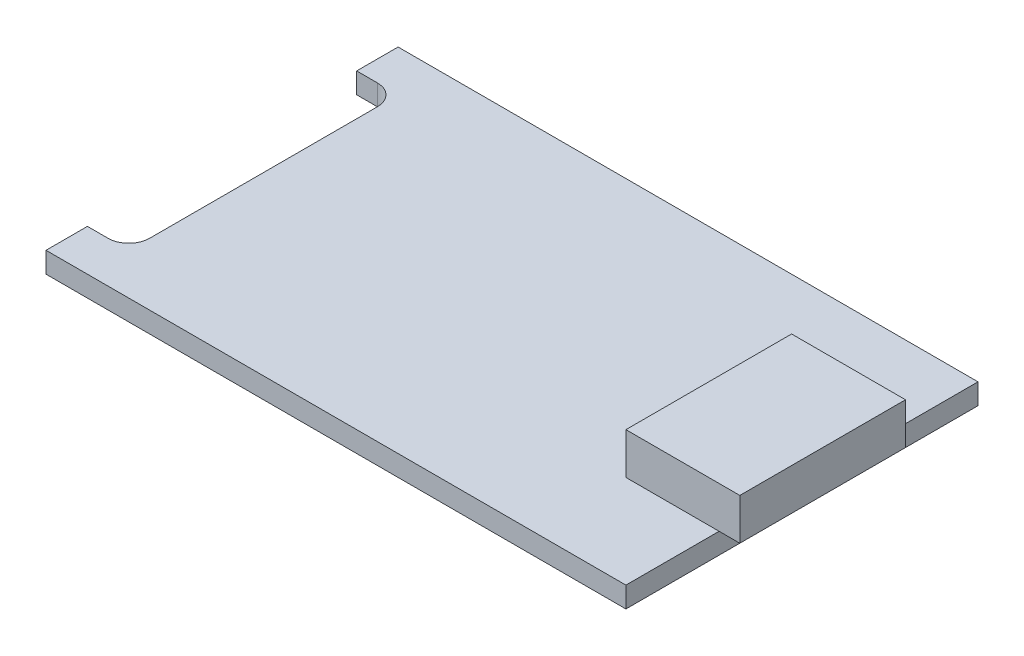
ISO-10303-21;
HEADER;
FILE_DESCRIPTION(('STEP AP214'),'2;1');
FILE_NAME('part.step','',(''),(''),'','','');
FILE_SCHEMA(('AUTOMOTIVE_DESIGN { 1 0 10303 214 1 1 1 1 }'));
ENDSEC;
DATA;
#1=APPLICATION_CONTEXT('core data for automotive mechanical design processes');
#2=APPLICATION_PROTOCOL_DEFINITION('international standard','automotive_design',2000,#1);
#3=PRODUCT_CONTEXT('',#1,'mechanical');
#4=PRODUCT('Part','Part','',(#3));
#5=PRODUCT_RELATED_PRODUCT_CATEGORY('part','',(#4));
#6=PRODUCT_DEFINITION_FORMATION('','',#4);
#7=PRODUCT_DEFINITION_CONTEXT('part definition',#1,'design');
#8=PRODUCT_DEFINITION('design','',#6,#7);
#9=PRODUCT_DEFINITION_SHAPE('','',#8);
#10=(LENGTH_UNIT() NAMED_UNIT(*) SI_UNIT(.MILLI.,.METRE.));
#11=(NAMED_UNIT(*) PLANE_ANGLE_UNIT() SI_UNIT($,.RADIAN.));
#12=(NAMED_UNIT(*) SI_UNIT($,.STERADIAN.) SOLID_ANGLE_UNIT());
#13=UNCERTAINTY_MEASURE_WITH_UNIT(LENGTH_MEASURE(1.E-05),#10,'distance_accuracy_value','');
#14=(GEOMETRIC_REPRESENTATION_CONTEXT(3) GLOBAL_UNCERTAINTY_ASSIGNED_CONTEXT((#13)) GLOBAL_UNIT_ASSIGNED_CONTEXT((#10,
#11,#12)) REPRESENTATION_CONTEXT('',''));
#15=CARTESIAN_POINT('',(0.,0.,0.));
#16=DIRECTION('',(0.,0.,1.));
#17=DIRECTION('',(1.,0.,0.));
#18=AXIS2_PLACEMENT_3D('',#15,#16,#17);
#19=CARTESIAN_POINT('',(-14.,1.,8.5));
#20=DIRECTION('',(1.,0.,0.));
#21=DIRECTION('',(0.,0.,-1.));
#22=AXIS2_PLACEMENT_3D('',#19,#20,#21);
#23=PLANE('',#22);
#24=DIRECTION('',(0.,0.,1.));
#25=VECTOR('',#24,1.);
#26=CARTESIAN_POINT('',(-14.,0.,8.5));
#27=LINE('',#26,#25);
#28=CARTESIAN_POINT('',(-14.,0.,-8.5));
#29=VERTEX_POINT('',#28);
#30=CARTESIAN_POINT('',(-14.,0.,-6.5));
#31=VERTEX_POINT('',#30);
#32=EDGE_CURVE('E167',#29,#31,#27,.T.);
#33=ORIENTED_EDGE('',*,*,#32,.T.);
#34=DIRECTION('',(0.,1.,0.));
#35=VECTOR('',#34,1.);
#36=CARTESIAN_POINT('',(-14.,0.,-6.5));
#37=LINE('',#36,#35);
#38=CARTESIAN_POINT('',(-14.,1.,-6.5));
#39=VERTEX_POINT('',#38);
#40=EDGE_CURVE('E160',#31,#39,#37,.T.);
#41=ORIENTED_EDGE('',*,*,#40,.T.);
#42=DIRECTION('',(0.,0.,1.));
#43=VECTOR('',#42,1.);
#44=CARTESIAN_POINT('',(-14.,1.,8.5));
#45=LINE('',#44,#43);
#46=CARTESIAN_POINT('',(-14.,1.,-8.5));
#47=VERTEX_POINT('',#46);
#48=EDGE_CURVE('E260',#47,#39,#45,.T.);
#49=ORIENTED_EDGE('',*,*,#48,.F.);
#50=DIRECTION('',(0.,-1.,0.));
#51=VECTOR('',#50,1.);
#52=CARTESIAN_POINT('',(-14.,1.,-8.5));
#53=LINE('',#52,#51);
#54=EDGE_CURVE('E183',#47,#29,#53,.T.);
#55=ORIENTED_EDGE('',*,*,#54,.T.);
#56=EDGE_LOOP('',(#33,#41,#49,#55));
#57=FACE_BOUND('',#56,.T.);
#58=ADVANCED_FACE('F35',(#57),#23,.F.);
#59=CARTESIAN_POINT('',(0.,1.,0.));
#60=DIRECTION('',(0.,-1.,0.));
#61=DIRECTION('',(0.,0.,-1.));
#62=AXIS2_PLACEMENT_3D('',#59,#60,#61);
#63=PLANE('',#62);
#64=ORIENTED_EDGE('',*,*,#48,.T.);
#65=DIRECTION('',(-1.,0.,0.));
#66=VECTOR('',#65,1.);
#67=CARTESIAN_POINT('',(-14.,1.,-6.5));
#68=LINE('',#67,#66);
#69=CARTESIAN_POINT('',(-13.,1.,-6.5));
#70=VERTEX_POINT('',#69);
#71=EDGE_CURVE('E151',#70,#39,#68,.T.);
#72=ORIENTED_EDGE('',*,*,#71,.F.);
#73=CARTESIAN_POINT('',(-13.,1.,-5.5));
#74=DIRECTION('',(0.,-1.,0.));
#75=DIRECTION('',(0.,0.,-1.));
#76=AXIS2_PLACEMENT_3D('',#73,#74,#75);
#77=CIRCLE('',#76,1.);
#78=CARTESIAN_POINT('',(-12.,1.,-5.5));
#79=VERTEX_POINT('',#78);
#80=EDGE_CURVE('E43',#70,#79,#77,.T.);
#81=ORIENTED_EDGE('',*,*,#80,.T.);
#82=DIRECTION('',(0.,0.,-1.));
#83=VECTOR('',#82,1.);
#84=CARTESIAN_POINT('',(-12.,1.,-6.5));
#85=LINE('',#84,#83);
#86=CARTESIAN_POINT('',(-12.,1.,5.5));
#87=VERTEX_POINT('',#86);
#88=EDGE_CURVE('E212',#87,#79,#85,.T.);
#89=ORIENTED_EDGE('',*,*,#88,.F.);
#90=CARTESIAN_POINT('',(-13.,1.,5.5));
#91=DIRECTION('',(0.,-1.,0.));
#92=DIRECTION('',(0.,0.,-1.));
#93=AXIS2_PLACEMENT_3D('',#90,#91,#92);
#94=CIRCLE('',#93,1.);
#95=CARTESIAN_POINT('',(-13.,1.,6.5));
#96=VERTEX_POINT('',#95);
#97=EDGE_CURVE('E203',#87,#96,#94,.T.);
#98=ORIENTED_EDGE('',*,*,#97,.T.);
#99=DIRECTION('',(1.,0.,0.));
#100=VECTOR('',#99,1.);
#101=CARTESIAN_POINT('',(-14.,1.,6.5));
#102=LINE('',#101,#100);
#103=CARTESIAN_POINT('',(-14.,1.,6.5));
#104=VERTEX_POINT('',#103);
#105=EDGE_CURVE('E217',#104,#96,#102,.T.);
#106=ORIENTED_EDGE('',*,*,#105,.F.);
#107=CARTESIAN_POINT('',(-14.,1.,8.5));
#108=VERTEX_POINT('',#107);
#109=EDGE_CURVE('E159',#104,#108,#45,.T.);
#110=ORIENTED_EDGE('',*,*,#109,.T.);
#111=DIRECTION('',(1.,0.,0.));
#112=VECTOR('',#111,1.);
#113=CARTESIAN_POINT('',(-14.,1.,8.5));
#114=LINE('',#113,#112);
#115=CARTESIAN_POINT('',(14.,1.,8.5));
#116=VERTEX_POINT('',#115);
#117=EDGE_CURVE('E262',#108,#116,#114,.T.);
#118=ORIENTED_EDGE('',*,*,#117,.T.);
#119=DIRECTION('',(0.,0.,-1.));
#120=VECTOR('',#119,1.);
#121=CARTESIAN_POINT('',(14.,1.,8.5));
#122=LINE('',#121,#120);
#123=CARTESIAN_POINT('',(14.,1.,4.));
#124=VERTEX_POINT('',#123);
#125=EDGE_CURVE('E264',#116,#124,#122,.T.);
#126=ORIENTED_EDGE('',*,*,#125,.T.);
#127=DIRECTION('',(1.,0.,0.));
#128=VECTOR('',#127,1.);
#129=CARTESIAN_POINT('',(15.,1.,4.));
#130=LINE('',#129,#128);
#131=CARTESIAN_POINT('',(9.5,1.,4.));
#132=VERTEX_POINT('',#131);
#133=EDGE_CURVE('E235',#132,#124,#130,.T.);
#134=ORIENTED_EDGE('',*,*,#133,.F.);
#135=DIRECTION('',(0.,0.,1.));
#136=VECTOR('',#135,1.);
#137=CARTESIAN_POINT('',(9.5,1.,-4.));
#138=LINE('',#137,#136);
#139=CARTESIAN_POINT('',(9.5,1.,-4.));
#140=VERTEX_POINT('',#139);
#141=EDGE_CURVE('E247',#140,#132,#138,.T.);
#142=ORIENTED_EDGE('',*,*,#141,.F.);
#143=DIRECTION('',(-1.,0.,0.));
#144=VECTOR('',#143,1.);
#145=CARTESIAN_POINT('',(15.,1.,-4.));
#146=LINE('',#145,#144);
#147=CARTESIAN_POINT('',(14.,1.,-4.));
#148=VERTEX_POINT('',#147);
#149=EDGE_CURVE('E194',#148,#140,#146,.T.);
#150=ORIENTED_EDGE('',*,*,#149,.F.);
#151=CARTESIAN_POINT('',(14.,1.,-8.5));
#152=VERTEX_POINT('',#151);
#153=EDGE_CURVE('E263',#148,#152,#122,.T.);
#154=ORIENTED_EDGE('',*,*,#153,.T.);
#155=DIRECTION('',(-1.,0.,0.));
#156=VECTOR('',#155,1.);
#157=CARTESIAN_POINT('',(-14.,1.,-8.5));
#158=LINE('',#157,#156);
#159=EDGE_CURVE('E176',#152,#47,#158,.T.);
#160=ORIENTED_EDGE('',*,*,#159,.T.);
#161=EDGE_LOOP('',(#64,#72,#81,#89,#98,#106,#110,#118,#126,#134,#142,#150,#154,#160));
#162=FACE_BOUND('',#161,.T.);
#163=ADVANCED_FACE('F211',(#162),#63,.F.);
#164=ORIENTED_EDGE('',*,*,#109,.F.);
#165=DIRECTION('',(0.,1.,0.));
#166=VECTOR('',#165,1.);
#167=CARTESIAN_POINT('',(-14.,0.,6.5));
#168=LINE('',#167,#166);
#169=CARTESIAN_POINT('',(-14.,0.,6.5));
#170=VERTEX_POINT('',#169);
#171=EDGE_CURVE('E144',#170,#104,#168,.T.);
#172=ORIENTED_EDGE('',*,*,#171,.F.);
#173=CARTESIAN_POINT('',(-14.,0.,8.5));
#174=VERTEX_POINT('',#173);
#175=EDGE_CURVE('E157',#170,#174,#27,.T.);
#176=ORIENTED_EDGE('',*,*,#175,.T.);
#177=DIRECTION('',(0.,-1.,0.));
#178=VECTOR('',#177,1.);
#179=CARTESIAN_POINT('',(-14.,1.,8.5));
#180=LINE('',#179,#178);
#181=EDGE_CURVE('E192',#108,#174,#180,.T.);
#182=ORIENTED_EDGE('',*,*,#181,.F.);
#183=EDGE_LOOP('',(#164,#172,#176,#182));
#184=FACE_BOUND('',#183,.T.);
#185=ADVANCED_FACE('F155',(#184),#23,.F.);
#186=CARTESIAN_POINT('',(-14.,1.,8.5));
#187=DIRECTION('',(0.,0.,-1.));
#188=DIRECTION('',(-1.,0.,0.));
#189=AXIS2_PLACEMENT_3D('',#186,#187,#188);
#190=PLANE('',#189);
#191=DIRECTION('',(1.,0.,0.));
#192=VECTOR('',#191,1.);
#193=CARTESIAN_POINT('',(-14.,0.,8.5));
#194=LINE('',#193,#192);
#195=CARTESIAN_POINT('',(14.,0.,8.5));
#196=VERTEX_POINT('',#195);
#197=EDGE_CURVE('E165',#174,#196,#194,.T.);
#198=ORIENTED_EDGE('',*,*,#197,.T.);
#199=DIRECTION('',(0.,-1.,0.));
#200=VECTOR('',#199,1.);
#201=CARTESIAN_POINT('',(14.,1.,8.5));
#202=LINE('',#201,#200);
#203=EDGE_CURVE('E189',#116,#196,#202,.T.);
#204=ORIENTED_EDGE('',*,*,#203,.F.);
#205=ORIENTED_EDGE('',*,*,#117,.F.);
#206=ORIENTED_EDGE('',*,*,#181,.T.);
#207=EDGE_LOOP('',(#198,#204,#205,#206));
#208=FACE_BOUND('',#207,.T.);
#209=ADVANCED_FACE('F290',(#208),#190,.F.);
#210=CARTESIAN_POINT('',(14.,1.,8.5));
#211=DIRECTION('',(-1.,0.,0.));
#212=DIRECTION('',(0.,0.,1.));
#213=AXIS2_PLACEMENT_3D('',#210,#211,#212);
#214=PLANE('',#213);
#215=DIRECTION('',(0.,0.,-1.));
#216=VECTOR('',#215,1.);
#217=CARTESIAN_POINT('',(14.,0.,8.5));
#218=LINE('',#217,#216);
#219=CARTESIAN_POINT('',(14.,0.,-8.5));
#220=VERTEX_POINT('',#219);
#221=EDGE_CURVE('E179',#196,#220,#218,.T.);
#222=ORIENTED_EDGE('',*,*,#221,.T.);
#223=DIRECTION('',(0.,-1.,0.));
#224=VECTOR('',#223,1.);
#225=CARTESIAN_POINT('',(14.,1.,-8.5));
#226=LINE('',#225,#224);
#227=EDGE_CURVE('E186',#152,#220,#226,.T.);
#228=ORIENTED_EDGE('',*,*,#227,.F.);
#229=ORIENTED_EDGE('',*,*,#153,.F.);
#230=EDGE_CURVE('E266',#124,#148,#122,.T.);
#231=ORIENTED_EDGE('',*,*,#230,.F.);
#232=ORIENTED_EDGE('',*,*,#125,.F.);
#233=ORIENTED_EDGE('',*,*,#203,.T.);
#234=EDGE_LOOP('',(#222,#228,#229,#231,#232,#233));
#235=FACE_BOUND('',#234,.T.);
#236=ADVANCED_FACE('F276',(#235),#214,.F.);
#237=CARTESIAN_POINT('',(-14.,1.,-8.5));
#238=DIRECTION('',(0.,0.,1.));
#239=DIRECTION('',(1.,0.,0.));
#240=AXIS2_PLACEMENT_3D('',#237,#238,#239);
#241=PLANE('',#240);
#242=DIRECTION('',(-1.,0.,0.));
#243=VECTOR('',#242,1.);
#244=CARTESIAN_POINT('',(-14.,0.,-8.5));
#245=LINE('',#244,#243);
#246=EDGE_CURVE('E181',#220,#29,#245,.T.);
#247=ORIENTED_EDGE('',*,*,#246,.T.);
#248=ORIENTED_EDGE('',*,*,#54,.F.);
#249=ORIENTED_EDGE('',*,*,#159,.F.);
#250=ORIENTED_EDGE('',*,*,#227,.T.);
#251=EDGE_LOOP('',(#247,#248,#249,#250));
#252=FACE_BOUND('',#251,.T.);
#253=ADVANCED_FACE('F279',(#252),#241,.F.);
#254=CARTESIAN_POINT('',(0.,0.,0.));
#255=DIRECTION('',(0.,-1.,0.));
#256=DIRECTION('',(0.,0.,-1.));
#257=AXIS2_PLACEMENT_3D('',#254,#255,#256);
#258=PLANE('',#257);
#259=DIRECTION('',(0.,0.,-1.));
#260=VECTOR('',#259,1.);
#261=CARTESIAN_POINT('',(-12.,0.,-6.5));
#262=LINE('',#261,#260);
#263=CARTESIAN_POINT('',(-12.,0.,5.5));
#264=VERTEX_POINT('',#263);
#265=CARTESIAN_POINT('',(-12.,0.,-5.5));
#266=VERTEX_POINT('',#265);
#267=EDGE_CURVE('E150',#264,#266,#262,.T.);
#268=ORIENTED_EDGE('',*,*,#267,.T.);
#269=CARTESIAN_POINT('',(-13.,0.,-5.5));
#270=DIRECTION('',(0.,-1.,0.));
#271=DIRECTION('',(0.,0.,-1.));
#272=AXIS2_PLACEMENT_3D('',#269,#270,#271);
#273=CIRCLE('',#272,1.);
#274=CARTESIAN_POINT('',(-13.,0.,-6.5));
#275=VERTEX_POINT('',#274);
#276=EDGE_CURVE('E11',#266,#275,#273,.F.);
#277=ORIENTED_EDGE('',*,*,#276,.T.);
#278=DIRECTION('',(-1.,0.,0.));
#279=VECTOR('',#278,1.);
#280=CARTESIAN_POINT('',(-14.,0.,-6.5));
#281=LINE('',#280,#279);
#282=EDGE_CURVE('E161',#275,#31,#281,.T.);
#283=ORIENTED_EDGE('',*,*,#282,.T.);
#284=ORIENTED_EDGE('',*,*,#32,.F.);
#285=ORIENTED_EDGE('',*,*,#246,.F.);
#286=ORIENTED_EDGE('',*,*,#221,.F.);
#287=ORIENTED_EDGE('',*,*,#197,.F.);
#288=ORIENTED_EDGE('',*,*,#175,.F.);
#289=DIRECTION('',(1.,0.,0.));
#290=VECTOR('',#289,1.);
#291=CARTESIAN_POINT('',(-14.,0.,6.5));
#292=LINE('',#291,#290);
#293=CARTESIAN_POINT('',(-13.,0.,6.5));
#294=VERTEX_POINT('',#293);
#295=EDGE_CURVE('E140',#170,#294,#292,.T.);
#296=ORIENTED_EDGE('',*,*,#295,.T.);
#297=CARTESIAN_POINT('',(-13.,0.,5.5));
#298=DIRECTION('',(0.,-1.,0.));
#299=DIRECTION('',(0.,0.,-1.));
#300=AXIS2_PLACEMENT_3D('',#297,#298,#299);
#301=CIRCLE('',#300,1.);
#302=EDGE_CURVE('E205',#294,#264,#301,.F.);
#303=ORIENTED_EDGE('',*,*,#302,.T.);
#304=EDGE_LOOP('',(#268,#277,#283,#284,#285,#286,#287,#288,#296,#303));
#305=FACE_BOUND('',#304,.T.);
#306=ADVANCED_FACE('F163',(#305),#258,.T.);
#307=CARTESIAN_POINT('',(15.,3.,-4.));
#308=DIRECTION('',(-1.,0.,0.));
#309=DIRECTION('',(0.,0.,1.));
#310=AXIS2_PLACEMENT_3D('',#307,#308,#309);
#311=PLANE('',#310);
#312=DIRECTION('',(0.,0.,-1.));
#313=VECTOR('',#312,1.);
#314=CARTESIAN_POINT('',(15.,1.,-4.));
#315=LINE('',#314,#313);
#316=CARTESIAN_POINT('',(15.,1.,4.));
#317=VERTEX_POINT('',#316);
#318=CARTESIAN_POINT('',(15.,1.,-4.));
#319=VERTEX_POINT('',#318);
#320=EDGE_CURVE('E229',#317,#319,#315,.T.);
#321=ORIENTED_EDGE('',*,*,#320,.T.);
#322=DIRECTION('',(0.,-1.,0.));
#323=VECTOR('',#322,1.);
#324=CARTESIAN_POINT('',(15.,3.,-4.));
#325=LINE('',#324,#323);
#326=CARTESIAN_POINT('',(15.,3.,-4.));
#327=VERTEX_POINT('',#326);
#328=EDGE_CURVE('E168',#327,#319,#325,.T.);
#329=ORIENTED_EDGE('',*,*,#328,.F.);
#330=DIRECTION('',(0.,0.,-1.));
#331=VECTOR('',#330,1.);
#332=CARTESIAN_POINT('',(15.,3.,-4.));
#333=LINE('',#332,#331);
#334=CARTESIAN_POINT('',(15.,3.,4.));
#335=VERTEX_POINT('',#334);
#336=EDGE_CURVE('E231',#335,#327,#333,.T.);
#337=ORIENTED_EDGE('',*,*,#336,.F.);
#338=DIRECTION('',(0.,-1.,0.));
#339=VECTOR('',#338,1.);
#340=CARTESIAN_POINT('',(15.,3.,4.));
#341=LINE('',#340,#339);
#342=EDGE_CURVE('E241',#335,#317,#341,.T.);
#343=ORIENTED_EDGE('',*,*,#342,.T.);
#344=EDGE_LOOP('',(#321,#329,#337,#343));
#345=FACE_BOUND('',#344,.T.);
#346=ADVANCED_FACE('F303',(#345),#311,.F.);
#347=CARTESIAN_POINT('',(15.,3.,-4.));
#348=DIRECTION('',(0.,0.,1.));
#349=DIRECTION('',(1.,0.,0.));
#350=AXIS2_PLACEMENT_3D('',#347,#348,#349);
#351=PLANE('',#350);
#352=EDGE_CURVE('E244',#319,#148,#146,.T.);
#353=ORIENTED_EDGE('',*,*,#352,.T.);
#354=ORIENTED_EDGE('',*,*,#149,.T.);
#355=DIRECTION('',(0.,-1.,0.));
#356=VECTOR('',#355,1.);
#357=CARTESIAN_POINT('',(9.5,3.,-4.));
#358=LINE('',#357,#356);
#359=CARTESIAN_POINT('',(9.5,3.,-4.));
#360=VERTEX_POINT('',#359);
#361=EDGE_CURVE('E172',#360,#140,#358,.T.);
#362=ORIENTED_EDGE('',*,*,#361,.F.);
#363=DIRECTION('',(-1.,0.,0.));
#364=VECTOR('',#363,1.);
#365=CARTESIAN_POINT('',(15.,3.,-4.));
#366=LINE('',#365,#364);
#367=EDGE_CURVE('E234',#327,#360,#366,.T.);
#368=ORIENTED_EDGE('',*,*,#367,.F.);
#369=ORIENTED_EDGE('',*,*,#328,.T.);
#370=EDGE_LOOP('',(#353,#354,#362,#368,#369));
#371=FACE_BOUND('',#370,.T.);
#372=ADVANCED_FACE('F307',(#371),#351,.F.);
#373=CARTESIAN_POINT('',(9.5,3.,-4.));
#374=DIRECTION('',(1.,0.,0.));
#375=DIRECTION('',(0.,0.,-1.));
#376=AXIS2_PLACEMENT_3D('',#373,#374,#375);
#377=PLANE('',#376);
#378=ORIENTED_EDGE('',*,*,#141,.T.);
#379=DIRECTION('',(0.,-1.,0.));
#380=VECTOR('',#379,1.);
#381=CARTESIAN_POINT('',(9.5,3.,4.));
#382=LINE('',#381,#380);
#383=CARTESIAN_POINT('',(9.5,3.,4.));
#384=VERTEX_POINT('',#383);
#385=EDGE_CURVE('E255',#384,#132,#382,.T.);
#386=ORIENTED_EDGE('',*,*,#385,.F.);
#387=DIRECTION('',(0.,0.,1.));
#388=VECTOR('',#387,1.);
#389=CARTESIAN_POINT('',(9.5,3.,-4.));
#390=LINE('',#389,#388);
#391=EDGE_CURVE('E237',#360,#384,#390,.T.);
#392=ORIENTED_EDGE('',*,*,#391,.F.);
#393=ORIENTED_EDGE('',*,*,#361,.T.);
#394=EDGE_LOOP('',(#378,#386,#392,#393));
#395=FACE_BOUND('',#394,.T.);
#396=ADVANCED_FACE('F311',(#395),#377,.F.);
#397=CARTESIAN_POINT('',(15.,3.,4.));
#398=DIRECTION('',(0.,0.,-1.));
#399=DIRECTION('',(-1.,0.,0.));
#400=AXIS2_PLACEMENT_3D('',#397,#398,#399);
#401=PLANE('',#400);
#402=ORIENTED_EDGE('',*,*,#133,.T.);
#403=EDGE_CURVE('E250',#124,#317,#130,.T.);
#404=ORIENTED_EDGE('',*,*,#403,.T.);
#405=ORIENTED_EDGE('',*,*,#342,.F.);
#406=DIRECTION('',(1.,0.,0.));
#407=VECTOR('',#406,1.);
#408=CARTESIAN_POINT('',(15.,3.,4.));
#409=LINE('',#408,#407);
#410=EDGE_CURVE('E239',#384,#335,#409,.T.);
#411=ORIENTED_EDGE('',*,*,#410,.F.);
#412=ORIENTED_EDGE('',*,*,#385,.T.);
#413=EDGE_LOOP('',(#402,#404,#405,#411,#412));
#414=FACE_BOUND('',#413,.T.);
#415=ADVANCED_FACE('F315',(#414),#401,.F.);
#416=CARTESIAN_POINT('',(0.,3.,0.));
#417=DIRECTION('',(0.,-1.,0.));
#418=DIRECTION('',(0.,0.,-1.));
#419=AXIS2_PLACEMENT_3D('',#416,#417,#418);
#420=PLANE('',#419);
#421=ORIENTED_EDGE('',*,*,#336,.T.);
#422=ORIENTED_EDGE('',*,*,#367,.T.);
#423=ORIENTED_EDGE('',*,*,#391,.T.);
#424=ORIENTED_EDGE('',*,*,#410,.T.);
#425=EDGE_LOOP('',(#421,#422,#423,#424));
#426=FACE_BOUND('',#425,.T.);
#427=ADVANCED_FACE('F319',(#426),#420,.F.);
#428=CARTESIAN_POINT('',(0.,1.,0.));
#429=DIRECTION('',(0.,-1.,0.));
#430=DIRECTION('',(0.,0.,-1.));
#431=AXIS2_PLACEMENT_3D('',#428,#429,#430);
#432=PLANE('',#431);
#433=ORIENTED_EDGE('',*,*,#403,.F.);
#434=ORIENTED_EDGE('',*,*,#230,.T.);
#435=ORIENTED_EDGE('',*,*,#352,.F.);
#436=ORIENTED_EDGE('',*,*,#320,.F.);
#437=EDGE_LOOP('',(#433,#434,#435,#436));
#438=FACE_BOUND('',#437,.T.);
#439=ADVANCED_FACE('F321',(#438),#432,.T.);
#440=CARTESIAN_POINT('',(-14.,0.,-6.5));
#441=DIRECTION('',(0.,0.,-1.));
#442=DIRECTION('',(-1.,0.,0.));
#443=AXIS2_PLACEMENT_3D('',#440,#441,#442);
#444=PLANE('',#443);
#445=ORIENTED_EDGE('',*,*,#282,.F.);
#446=DIRECTION('',(0.,1.,0.));
#447=VECTOR('',#446,1.);
#448=CARTESIAN_POINT('',(-13.,1.,-6.5));
#449=LINE('',#448,#447);
#450=EDGE_CURVE('E201',#275,#70,#449,.T.);
#451=ORIENTED_EDGE('',*,*,#450,.T.);
#452=ORIENTED_EDGE('',*,*,#71,.T.);
#453=ORIENTED_EDGE('',*,*,#40,.F.);
#454=EDGE_LOOP('',(#445,#451,#452,#453));
#455=FACE_BOUND('',#454,.T.);
#456=ADVANCED_FACE('F220',(#455),#444,.F.);
#457=CARTESIAN_POINT('',(-12.,0.,-6.5));
#458=DIRECTION('',(1.,0.,0.));
#459=DIRECTION('',(0.,0.,-1.));
#460=AXIS2_PLACEMENT_3D('',#457,#458,#459);
#461=PLANE('',#460);
#462=ORIENTED_EDGE('',*,*,#267,.F.);
#463=DIRECTION('',(0.,1.,0.));
#464=VECTOR('',#463,1.);
#465=CARTESIAN_POINT('',(-12.,1.,5.5));
#466=LINE('',#465,#464);
#467=EDGE_CURVE('E197',#264,#87,#466,.T.);
#468=ORIENTED_EDGE('',*,*,#467,.T.);
#469=ORIENTED_EDGE('',*,*,#88,.T.);
#470=DIRECTION('',(0.,1.,0.));
#471=VECTOR('',#470,1.);
#472=CARTESIAN_POINT('',(-12.,0.,-5.5));
#473=LINE('',#472,#471);
#474=EDGE_CURVE('E195',#79,#266,#473,.F.);
#475=ORIENTED_EDGE('',*,*,#474,.T.);
#476=EDGE_LOOP('',(#462,#468,#469,#475));
#477=FACE_BOUND('',#476,.T.);
#478=ADVANCED_FACE('F215',(#477),#461,.F.);
#479=CARTESIAN_POINT('',(-14.,0.,6.5));
#480=DIRECTION('',(0.,0.,1.));
#481=DIRECTION('',(1.,0.,0.));
#482=AXIS2_PLACEMENT_3D('',#479,#480,#481);
#483=PLANE('',#482);
#484=ORIENTED_EDGE('',*,*,#105,.T.);
#485=DIRECTION('',(0.,1.,0.));
#486=VECTOR('',#485,1.);
#487=CARTESIAN_POINT('',(-13.,0.,6.5));
#488=LINE('',#487,#486);
#489=EDGE_CURVE('E147',#96,#294,#488,.F.);
#490=ORIENTED_EDGE('',*,*,#489,.T.);
#491=ORIENTED_EDGE('',*,*,#295,.F.);
#492=ORIENTED_EDGE('',*,*,#171,.T.);
#493=EDGE_LOOP('',(#484,#490,#491,#492));
#494=FACE_BOUND('',#493,.T.);
#495=ADVANCED_FACE('F143',(#494),#483,.F.);
#496=CARTESIAN_POINT('',(-13.,0.,5.5));
#497=DIRECTION('',(0.,-1.,0.));
#498=DIRECTION('',(0.,0.,-1.));
#499=AXIS2_PLACEMENT_3D('',#496,#497,#498);
#500=CYLINDRICAL_SURFACE('',#499,1.);
#501=ORIENTED_EDGE('',*,*,#302,.F.);
#502=ORIENTED_EDGE('',*,*,#489,.F.);
#503=ORIENTED_EDGE('',*,*,#97,.F.);
#504=ORIENTED_EDGE('',*,*,#467,.F.);
#505=EDGE_LOOP('',(#501,#502,#503,#504));
#506=FACE_BOUND('',#505,.T.);
#507=ADVANCED_FACE('F330',(#506),#500,.F.);
#508=CARTESIAN_POINT('',(-13.,0.,-5.5));
#509=DIRECTION('',(0.,-1.,0.));
#510=DIRECTION('',(0.,0.,-1.));
#511=AXIS2_PLACEMENT_3D('',#508,#509,#510);
#512=CYLINDRICAL_SURFACE('',#511,1.);
#513=ORIENTED_EDGE('',*,*,#276,.F.);
#514=ORIENTED_EDGE('',*,*,#474,.F.);
#515=ORIENTED_EDGE('',*,*,#80,.F.);
#516=ORIENTED_EDGE('',*,*,#450,.F.);
#517=EDGE_LOOP('',(#513,#514,#515,#516));
#518=FACE_BOUND('',#517,.T.);
#519=ADVANCED_FACE('F37',(#518),#512,.F.);
#520=CLOSED_SHELL('',(#58,#163,#185,#209,#236,#253,#306,#346,#372,#396,#415,#427,#439,#456,#478,
#495,#507,#519));
#521=MANIFOLD_SOLID_BREP('B2',#520);
#522=ADVANCED_BREP_SHAPE_REPRESENTATION('',(#18,#521),#14);
#523=SHAPE_DEFINITION_REPRESENTATION(#9,#522);
ENDSEC;
END-ISO-10303-21;
